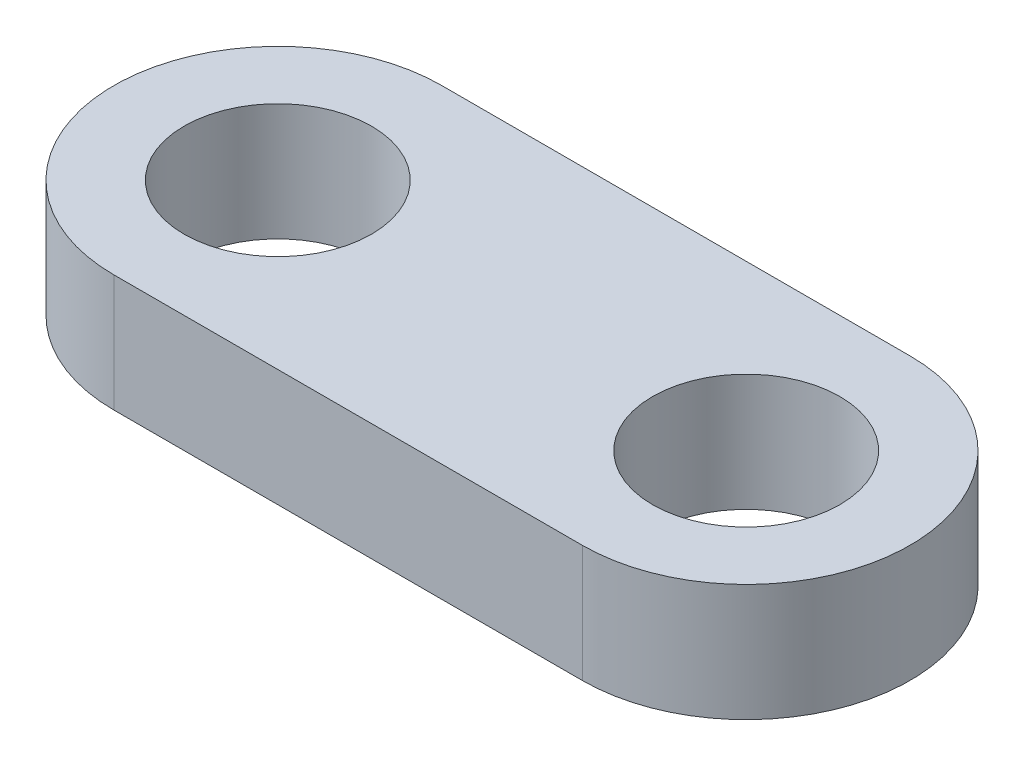
ISO-10303-21;
HEADER;
FILE_DESCRIPTION(('STEP AP214'),'2;1');
FILE_NAME('part.step','',(''),(''),'','','');
FILE_SCHEMA(('AUTOMOTIVE_DESIGN { 1 0 10303 214 1 1 1 1 }'));
ENDSEC;
DATA;
#1=APPLICATION_CONTEXT('core data for automotive mechanical design processes');
#2=APPLICATION_PROTOCOL_DEFINITION('international standard','automotive_design',2000,#1);
#3=PRODUCT_CONTEXT('',#1,'mechanical');
#4=PRODUCT('Part','Part','',(#3));
#5=PRODUCT_RELATED_PRODUCT_CATEGORY('part','',(#4));
#6=PRODUCT_DEFINITION_FORMATION('','',#4);
#7=PRODUCT_DEFINITION_CONTEXT('part definition',#1,'design');
#8=PRODUCT_DEFINITION('design','',#6,#7);
#9=PRODUCT_DEFINITION_SHAPE('','',#8);
#10=(LENGTH_UNIT() NAMED_UNIT(*) SI_UNIT(.MILLI.,.METRE.));
#11=(NAMED_UNIT(*) PLANE_ANGLE_UNIT() SI_UNIT($,.RADIAN.));
#12=(NAMED_UNIT(*) SI_UNIT($,.STERADIAN.) SOLID_ANGLE_UNIT());
#13=UNCERTAINTY_MEASURE_WITH_UNIT(LENGTH_MEASURE(1.E-05),#10,'distance_accuracy_value','');
#14=(GEOMETRIC_REPRESENTATION_CONTEXT(3) GLOBAL_UNCERTAINTY_ASSIGNED_CONTEXT((#13)) GLOBAL_UNIT_ASSIGNED_CONTEXT((#10,
#11,#12)) REPRESENTATION_CONTEXT('',''));
#15=CARTESIAN_POINT('',(0.,0.,0.));
#16=DIRECTION('',(0.,0.,1.));
#17=DIRECTION('',(1.,0.,0.));
#18=AXIS2_PLACEMENT_3D('',#15,#16,#17);
#19=CARTESIAN_POINT('',(0.,2.5,0.));
#20=DIRECTION('',(0.,1.,0.));
#21=DIRECTION('',(0.,0.,1.));
#22=AXIS2_PLACEMENT_3D('',#19,#20,#21);
#23=PLANE('',#22);
#24=CARTESIAN_POINT('',(0.,2.5,0.));
#25=DIRECTION('',(0.,1.,0.));
#26=DIRECTION('',(0.,0.,1.));
#27=AXIS2_PLACEMENT_3D('',#24,#25,#26);
#28=CIRCLE('',#27,4.);
#29=CARTESIAN_POINT('',(0.,2.5,4.));
#30=VERTEX_POINT('',#29);
#31=EDGE_CURVE('E106',#30,#30,#28,.T.);
#32=ORIENTED_EDGE('',*,*,#31,.F.);
#33=EDGE_LOOP('',(#32));
#34=FACE_BOUND('',#33,.T.);
#35=CARTESIAN_POINT('',(0.,2.5,0.));
#36=DIRECTION('',(0.,1.,0.));
#37=DIRECTION('',(0.,0.,1.));
#38=AXIS2_PLACEMENT_3D('',#35,#36,#37);
#39=CIRCLE('',#38,7.);
#40=CARTESIAN_POINT('',(0.,2.5,-7.));
#41=VERTEX_POINT('',#40);
#42=CARTESIAN_POINT('',(0.,2.5,7.));
#43=VERTEX_POINT('',#42);
#44=EDGE_CURVE('E91',#41,#43,#39,.T.);
#45=ORIENTED_EDGE('',*,*,#44,.T.);
#46=DIRECTION('',(1.,0.,0.));
#47=VECTOR('',#46,1.);
#48=CARTESIAN_POINT('',(0.,2.5,7.));
#49=LINE('',#48,#47);
#50=CARTESIAN_POINT('',(20.,2.5,7.));
#51=VERTEX_POINT('',#50);
#52=EDGE_CURVE('E86',#43,#51,#49,.T.);
#53=ORIENTED_EDGE('',*,*,#52,.T.);
#54=CARTESIAN_POINT('',(20.,2.5,0.));
#55=DIRECTION('',(0.,1.,0.));
#56=DIRECTION('',(0.,0.,1.));
#57=AXIS2_PLACEMENT_3D('',#54,#55,#56);
#58=CIRCLE('',#57,7.);
#59=CARTESIAN_POINT('',(20.,2.5,-7.));
#60=VERTEX_POINT('',#59);
#61=EDGE_CURVE('E89',#51,#60,#58,.T.);
#62=ORIENTED_EDGE('',*,*,#61,.T.);
#63=DIRECTION('',(-1.,0.,0.));
#64=VECTOR('',#63,1.);
#65=CARTESIAN_POINT('',(0.,2.5,-7.));
#66=LINE('',#65,#64);
#67=EDGE_CURVE('E56',#60,#41,#66,.T.);
#68=ORIENTED_EDGE('',*,*,#67,.T.);
#69=EDGE_LOOP('',(#45,#53,#62,#68));
#70=FACE_BOUND('',#69,.T.);
#71=CARTESIAN_POINT('',(20.,2.5,0.));
#72=DIRECTION('',(0.,1.,0.));
#73=DIRECTION('',(0.,0.,1.));
#74=AXIS2_PLACEMENT_3D('',#71,#72,#73);
#75=CIRCLE('',#74,4.);
#76=CARTESIAN_POINT('',(20.,2.5,4.));
#77=VERTEX_POINT('',#76);
#78=EDGE_CURVE('E121',#77,#77,#75,.T.);
#79=ORIENTED_EDGE('',*,*,#78,.F.);
#80=EDGE_LOOP('',(#79));
#81=FACE_BOUND('',#80,.T.);
#82=ADVANCED_FACE('F39',(#34,#70,#81),#23,.T.);
#83=CARTESIAN_POINT('',(0.,-2.5,0.));
#84=DIRECTION('',(0.,1.,0.));
#85=DIRECTION('',(0.,0.,1.));
#86=AXIS2_PLACEMENT_3D('',#83,#84,#85);
#87=PLANE('',#86);
#88=CARTESIAN_POINT('',(0.,-2.5,0.));
#89=DIRECTION('',(0.,1.,0.));
#90=DIRECTION('',(0.,0.,1.));
#91=AXIS2_PLACEMENT_3D('',#88,#89,#90);
#92=CIRCLE('',#91,7.);
#93=CARTESIAN_POINT('',(0.,-2.5,-7.));
#94=VERTEX_POINT('',#93);
#95=CARTESIAN_POINT('',(0.,-2.5,7.));
#96=VERTEX_POINT('',#95);
#97=EDGE_CURVE('E103',#94,#96,#92,.T.);
#98=ORIENTED_EDGE('',*,*,#97,.F.);
#99=DIRECTION('',(-1.,0.,0.));
#100=VECTOR('',#99,1.);
#101=CARTESIAN_POINT('',(0.,-2.5,-7.));
#102=LINE('',#101,#100);
#103=CARTESIAN_POINT('',(20.,-2.5,-7.));
#104=VERTEX_POINT('',#103);
#105=EDGE_CURVE('E79',#104,#94,#102,.T.);
#106=ORIENTED_EDGE('',*,*,#105,.F.);
#107=CARTESIAN_POINT('',(20.,-2.5,0.));
#108=DIRECTION('',(0.,1.,0.));
#109=DIRECTION('',(0.,0.,1.));
#110=AXIS2_PLACEMENT_3D('',#107,#108,#109);
#111=CIRCLE('',#110,7.);
#112=CARTESIAN_POINT('',(20.,-2.5,7.));
#113=VERTEX_POINT('',#112);
#114=EDGE_CURVE('E73',#113,#104,#111,.T.);
#115=ORIENTED_EDGE('',*,*,#114,.F.);
#116=DIRECTION('',(1.,0.,0.));
#117=VECTOR('',#116,1.);
#118=CARTESIAN_POINT('',(0.,-2.5,7.));
#119=LINE('',#118,#117);
#120=EDGE_CURVE('E95',#96,#113,#119,.T.);
#121=ORIENTED_EDGE('',*,*,#120,.F.);
#122=EDGE_LOOP('',(#98,#106,#115,#121));
#123=FACE_BOUND('',#122,.T.);
#124=CARTESIAN_POINT('',(0.,-2.5,0.));
#125=DIRECTION('',(0.,1.,0.));
#126=DIRECTION('',(0.,0.,1.));
#127=AXIS2_PLACEMENT_3D('',#124,#125,#126);
#128=CIRCLE('',#127,4.);
#129=CARTESIAN_POINT('',(0.,-2.5,4.));
#130=VERTEX_POINT('',#129);
#131=EDGE_CURVE('E118',#130,#130,#128,.T.);
#132=ORIENTED_EDGE('',*,*,#131,.T.);
#133=EDGE_LOOP('',(#132));
#134=FACE_BOUND('',#133,.T.);
#135=CARTESIAN_POINT('',(20.,-2.5,0.));
#136=DIRECTION('',(0.,1.,0.));
#137=DIRECTION('',(0.,0.,1.));
#138=AXIS2_PLACEMENT_3D('',#135,#136,#137);
#139=CIRCLE('',#138,4.);
#140=CARTESIAN_POINT('',(20.,-2.5,4.));
#141=VERTEX_POINT('',#140);
#142=EDGE_CURVE('E124',#141,#141,#139,.T.);
#143=ORIENTED_EDGE('',*,*,#142,.T.);
#144=EDGE_LOOP('',(#143));
#145=FACE_BOUND('',#144,.T.);
#146=ADVANCED_FACE('F114',(#123,#134,#145),#87,.F.);
#147=CARTESIAN_POINT('',(0.,2.5,0.));
#148=DIRECTION('',(0.,-1.,0.));
#149=DIRECTION('',(0.,0.,-1.));
#150=AXIS2_PLACEMENT_3D('',#147,#148,#149);
#151=CYLINDRICAL_SURFACE('',#150,7.);
#152=ORIENTED_EDGE('',*,*,#97,.T.);
#153=DIRECTION('',(0.,-1.,0.));
#154=VECTOR('',#153,1.);
#155=CARTESIAN_POINT('',(0.,2.5,7.));
#156=LINE('',#155,#154);
#157=EDGE_CURVE('E11',#43,#96,#156,.T.);
#158=ORIENTED_EDGE('',*,*,#157,.F.);
#159=ORIENTED_EDGE('',*,*,#44,.F.);
#160=DIRECTION('',(0.,-1.,0.));
#161=VECTOR('',#160,1.);
#162=CARTESIAN_POINT('',(0.,2.5,-7.));
#163=LINE('',#162,#161);
#164=EDGE_CURVE('E99',#41,#94,#163,.T.);
#165=ORIENTED_EDGE('',*,*,#164,.T.);
#166=EDGE_LOOP('',(#152,#158,#159,#165));
#167=FACE_BOUND('',#166,.T.);
#168=ADVANCED_FACE('F41',(#167),#151,.T.);
#169=CARTESIAN_POINT('',(0.,2.5,7.));
#170=DIRECTION('',(0.,0.,-1.));
#171=DIRECTION('',(-1.,0.,0.));
#172=AXIS2_PLACEMENT_3D('',#169,#170,#171);
#173=PLANE('',#172);
#174=ORIENTED_EDGE('',*,*,#120,.T.);
#175=DIRECTION('',(0.,-1.,0.));
#176=VECTOR('',#175,1.);
#177=CARTESIAN_POINT('',(20.,2.5,7.));
#178=LINE('',#177,#176);
#179=EDGE_CURVE('E48',#51,#113,#178,.T.);
#180=ORIENTED_EDGE('',*,*,#179,.F.);
#181=ORIENTED_EDGE('',*,*,#52,.F.);
#182=ORIENTED_EDGE('',*,*,#157,.T.);
#183=EDGE_LOOP('',(#174,#180,#181,#182));
#184=FACE_BOUND('',#183,.T.);
#185=ADVANCED_FACE('F94',(#184),#173,.F.);
#186=CARTESIAN_POINT('',(20.,2.5,0.));
#187=DIRECTION('',(0.,-1.,0.));
#188=DIRECTION('',(0.,0.,-1.));
#189=AXIS2_PLACEMENT_3D('',#186,#187,#188);
#190=CYLINDRICAL_SURFACE('',#189,7.);
#191=ORIENTED_EDGE('',*,*,#114,.T.);
#192=DIRECTION('',(0.,-1.,0.));
#193=VECTOR('',#192,1.);
#194=CARTESIAN_POINT('',(20.,2.5,-7.));
#195=LINE('',#194,#193);
#196=EDGE_CURVE('E96',#60,#104,#195,.T.);
#197=ORIENTED_EDGE('',*,*,#196,.F.);
#198=ORIENTED_EDGE('',*,*,#61,.F.);
#199=ORIENTED_EDGE('',*,*,#179,.T.);
#200=EDGE_LOOP('',(#191,#197,#198,#199));
#201=FACE_BOUND('',#200,.T.);
#202=ADVANCED_FACE('F97',(#201),#190,.T.);
#203=CARTESIAN_POINT('',(0.,2.5,-7.));
#204=DIRECTION('',(0.,0.,1.));
#205=DIRECTION('',(1.,0.,0.));
#206=AXIS2_PLACEMENT_3D('',#203,#204,#205);
#207=PLANE('',#206);
#208=ORIENTED_EDGE('',*,*,#105,.T.);
#209=ORIENTED_EDGE('',*,*,#164,.F.);
#210=ORIENTED_EDGE('',*,*,#67,.F.);
#211=ORIENTED_EDGE('',*,*,#196,.T.);
#212=EDGE_LOOP('',(#208,#209,#210,#211));
#213=FACE_BOUND('',#212,.T.);
#214=ADVANCED_FACE('F111',(#213),#207,.F.);
#215=CARTESIAN_POINT('',(0.,2.5,0.));
#216=DIRECTION('',(0.,-1.,0.));
#217=DIRECTION('',(0.,0.,-1.));
#218=AXIS2_PLACEMENT_3D('',#215,#216,#217);
#219=CYLINDRICAL_SURFACE('',#218,4.);
#220=ORIENTED_EDGE('',*,*,#31,.T.);
#221=EDGE_LOOP('',(#220));
#222=FACE_BOUND('',#221,.T.);
#223=ORIENTED_EDGE('',*,*,#131,.F.);
#224=EDGE_LOOP('',(#223));
#225=FACE_BOUND('',#224,.T.);
#226=ADVANCED_FACE('F141',(#222,#225),#219,.F.);
#227=CARTESIAN_POINT('',(20.,2.5,0.));
#228=DIRECTION('',(0.,-1.,0.));
#229=DIRECTION('',(0.,0.,-1.));
#230=AXIS2_PLACEMENT_3D('',#227,#228,#229);
#231=CYLINDRICAL_SURFACE('',#230,4.);
#232=ORIENTED_EDGE('',*,*,#78,.T.);
#233=EDGE_LOOP('',(#232));
#234=FACE_BOUND('',#233,.T.);
#235=ORIENTED_EDGE('',*,*,#142,.F.);
#236=EDGE_LOOP('',(#235));
#237=FACE_BOUND('',#236,.T.);
#238=ADVANCED_FACE('F130',(#234,#237),#231,.F.);
#239=CLOSED_SHELL('',(#82,#146,#168,#185,#202,#214,#226,#238));
#240=MANIFOLD_SOLID_BREP('B2',#239);
#241=ADVANCED_BREP_SHAPE_REPRESENTATION('',(#18,#240),#14);
#242=SHAPE_DEFINITION_REPRESENTATION(#9,#241);
ENDSEC;
END-ISO-10303-21;
